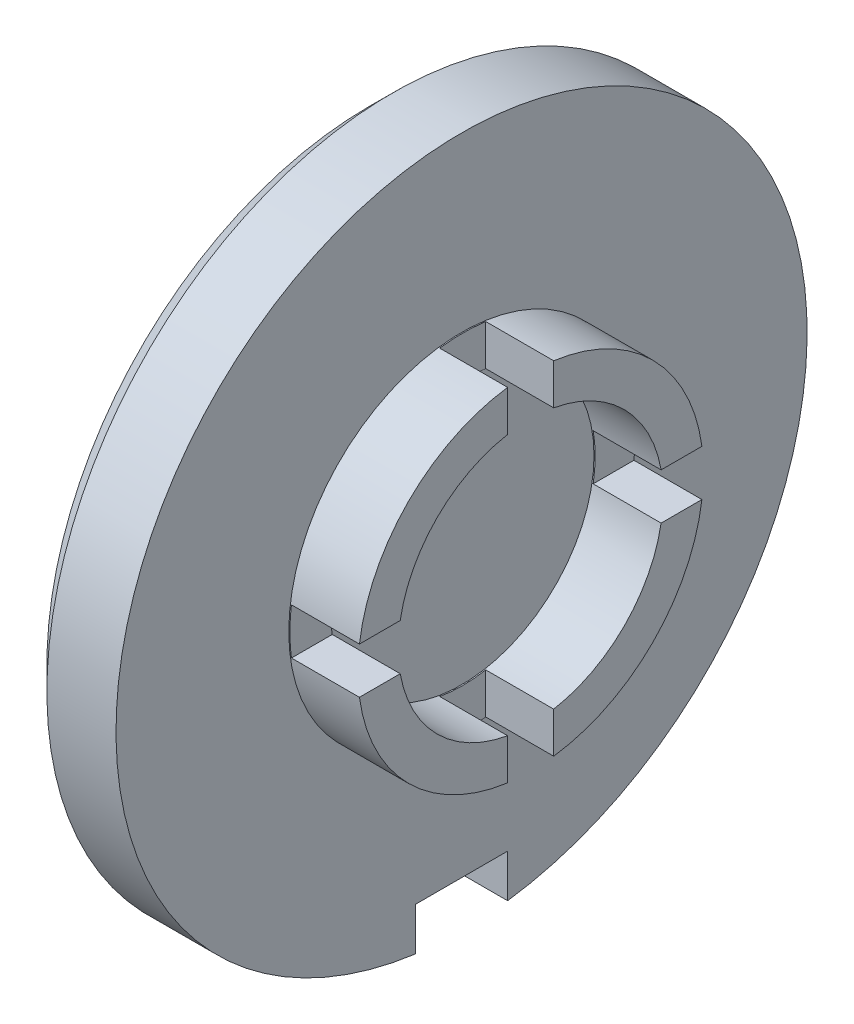
ISO-10303-21;
HEADER;
FILE_DESCRIPTION(('STEP AP214'),'2;1');
FILE_NAME('part.step','',(''),(''),'','','');
FILE_SCHEMA(('AUTOMOTIVE_DESIGN { 1 0 10303 214 1 1 1 1 }'));
ENDSEC;
DATA;
#1=APPLICATION_CONTEXT('core data for automotive mechanical design processes');
#2=APPLICATION_PROTOCOL_DEFINITION('international standard','automotive_design',2000,#1);
#3=PRODUCT_CONTEXT('',#1,'mechanical');
#4=PRODUCT('Part','Part','',(#3));
#5=PRODUCT_RELATED_PRODUCT_CATEGORY('part','',(#4));
#6=PRODUCT_DEFINITION_FORMATION('','',#4);
#7=PRODUCT_DEFINITION_CONTEXT('part definition',#1,'design');
#8=PRODUCT_DEFINITION('design','',#6,#7);
#9=PRODUCT_DEFINITION_SHAPE('','',#8);
#10=(LENGTH_UNIT() NAMED_UNIT(*) SI_UNIT(.MILLI.,.METRE.));
#11=(NAMED_UNIT(*) PLANE_ANGLE_UNIT() SI_UNIT($,.RADIAN.));
#12=(NAMED_UNIT(*) SI_UNIT($,.STERADIAN.) SOLID_ANGLE_UNIT());
#13=UNCERTAINTY_MEASURE_WITH_UNIT(LENGTH_MEASURE(1.E-05),#10,'distance_accuracy_value','');
#14=(GEOMETRIC_REPRESENTATION_CONTEXT(3) GLOBAL_UNCERTAINTY_ASSIGNED_CONTEXT((#13)) GLOBAL_UNIT_ASSIGNED_CONTEXT((#10,
#11,#12)) REPRESENTATION_CONTEXT('',''));
#15=CARTESIAN_POINT('',(0.,0.,0.));
#16=DIRECTION('',(0.,0.,1.));
#17=DIRECTION('',(1.,0.,0.));
#18=AXIS2_PLACEMENT_3D('',#15,#16,#17);
#19=CARTESIAN_POINT('',(-76.8,-20.,66.));
#20=DIRECTION('',(1.,0.,0.));
#21=DIRECTION('',(0.,0.,-1.));
#22=AXIS2_PLACEMENT_3D('',#19,#20,#21);
#23=PLANE('',#22);
#24=DIRECTION('',(0.,1.,0.));
#25=VECTOR('',#24,1.);
#26=CARTESIAN_POINT('',(-76.8,-20.,66.8));
#27=LINE('',#26,#25);
#28=CARTESIAN_POINT('',(-76.8,-25.5425625842204,66.8));
#29=VERTEX_POINT('',#28);
#30=CARTESIAN_POINT('',(-76.8,-25.2,66.8));
#31=VERTEX_POINT('',#30);
#32=EDGE_CURVE('E359',#29,#31,#27,.T.);
#33=ORIENTED_EDGE('',*,*,#32,.F.);
#34=CARTESIAN_POINT('',(-76.8,-20.,66.));
#35=DIRECTION('',(-1.,0.,0.));
#36=DIRECTION('',(0.,0.,1.));
#37=AXIS2_PLACEMENT_3D('',#34,#35,#36);
#38=CIRCLE('',#37,5.6);
#39=CARTESIAN_POINT('',(-76.8,-25.5425625842204,65.2));
#40=VERTEX_POINT('',#39);
#41=EDGE_CURVE('E260',#29,#40,#38,.T.);
#42=ORIENTED_EDGE('',*,*,#41,.T.);
#43=DIRECTION('',(0.,1.,0.));
#44=VECTOR('',#43,1.);
#45=CARTESIAN_POINT('',(-76.8,-20.,65.2));
#46=LINE('',#45,#44);
#47=CARTESIAN_POINT('',(-76.8,-25.2,65.2));
#48=VERTEX_POINT('',#47);
#49=EDGE_CURVE('E395',#40,#48,#46,.T.);
#50=ORIENTED_EDGE('',*,*,#49,.T.);
#51=DIRECTION('',(0.,0.,-1.));
#52=VECTOR('',#51,1.);
#53=CARTESIAN_POINT('',(-76.8,-25.2,66.));
#54=LINE('',#53,#52);
#55=EDGE_CURVE('E205',#31,#48,#54,.T.);
#56=ORIENTED_EDGE('',*,*,#55,.F.);
#57=EDGE_LOOP('',(#33,#42,#50,#56));
#58=FACE_BOUND('',#57,.T.);
#59=ADVANCED_FACE('F47',(#58),#23,.F.);
#60=CARTESIAN_POINT('',(-76.4,-20.,66.));
#61=DIRECTION('',(1.,0.,0.));
#62=DIRECTION('',(0.,0.,-1.));
#63=AXIS2_PLACEMENT_3D('',#60,#61,#62);
#64=CONICAL_SURFACE('',#63,6.,0.78539816339747);
#65=CARTESIAN_POINT('',(-75.5053728090001,-26.8480569582091,66.8));
#66=CARTESIAN_POINT('',(-75.6881030317566,-26.6640807466869,66.8));
#67=CARTESIAN_POINT('',(-75.8707866928955,-26.480058250433,66.8));
#68=CARTESIAN_POINT('',(-76.2360245862569,-26.1118852017641,66.8));
#69=CARTESIAN_POINT('',(-76.418578818597,-25.9277346494659,66.8));
#70=CARTESIAN_POINT('',(-76.7835219670777,-25.5592695807787,66.8));
#71=CARTESIAN_POINT('',(-76.9659108831408,-25.374955064313,66.8));
#72=CARTESIAN_POINT('',(-77.3304582431577,-25.0060979425621,66.8));
#73=CARTESIAN_POINT('',(-77.5126166868986,-24.8215553370668,66.8));
#74=CARTESIAN_POINT('',(-77.6946271909999,-24.6368667515551,66.8));
#75=B_SPLINE_CURVE_WITH_KNOTS('',3,(#65,#66,#67,#68,#69,#70,#71,#72,#73,#74),.UNSPECIFIED.,.F.,
.F.,(4,2,2,2,4),(0.,0.777906337908829,1.55581196755155,2.33371796179654,3.11162467374078),.UNSPECIFIED.);
#76=CARTESIAN_POINT('',(-76.4,-25.9464274989274,66.8));
#77=VERTEX_POINT('',#76);
#78=EDGE_CURVE('E362',#77,#29,#75,.T.);
#79=ORIENTED_EDGE('',*,*,#78,.F.);
#80=CARTESIAN_POINT('',(-76.4,-20.,66.));
#81=DIRECTION('',(-1.,0.,0.));
#82=DIRECTION('',(0.,0.,1.));
#83=AXIS2_PLACEMENT_3D('',#80,#81,#82);
#84=CIRCLE('',#83,6.);
#85=CARTESIAN_POINT('',(-76.4,-25.9464274989274,65.2));
#86=VERTEX_POINT('',#85);
#87=EDGE_CURVE('E264',#77,#86,#84,.T.);
#88=ORIENTED_EDGE('',*,*,#87,.T.);
#89=CARTESIAN_POINT('',(-75.5053728090001,-26.8480569582091,65.2));
#90=CARTESIAN_POINT('',(-75.6881030317566,-26.6640807466869,65.2));
#91=CARTESIAN_POINT('',(-75.8707866928955,-26.480058250433,65.2));
#92=CARTESIAN_POINT('',(-76.2360245862569,-26.1118852017641,65.2));
#93=CARTESIAN_POINT('',(-76.418578818597,-25.9277346494659,65.2));
#94=CARTESIAN_POINT('',(-76.7835219670777,-25.5592695807787,65.2));
#95=CARTESIAN_POINT('',(-76.9659108831408,-25.374955064313,65.2));
#96=CARTESIAN_POINT('',(-77.3304582431577,-25.0060979425621,65.2));
#97=CARTESIAN_POINT('',(-77.5126166868986,-24.8215553370668,65.2));
#98=CARTESIAN_POINT('',(-77.6946271909999,-24.6368667515551,65.2));
#99=B_SPLINE_CURVE_WITH_KNOTS('',3,(#89,#90,#91,#92,#93,#94,#95,#96,#97,#98),.UNSPECIFIED.,.F.,
.F.,(4,2,2,2,4),(0.,0.777906337908829,1.55581196755155,2.33371796179654,3.11162467374078),.UNSPECIFIED.);
#100=EDGE_CURVE('E387',#86,#40,#99,.T.);
#101=ORIENTED_EDGE('',*,*,#100,.T.);
#102=ORIENTED_EDGE('',*,*,#41,.F.);
#103=EDGE_LOOP('',(#79,#88,#101,#102));
#104=FACE_BOUND('',#103,.T.);
#105=ADVANCED_FACE('F373',(#104),#64,.T.);
#106=CARTESIAN_POINT('',(-81.8,-20.,66.));
#107=DIRECTION('',(-1.,0.,0.));
#108=DIRECTION('',(0.,0.,1.));
#109=AXIS2_PLACEMENT_3D('',#106,#107,#108);
#110=CYLINDRICAL_SURFACE('',#109,6.);
#111=DIRECTION('',(-1.,0.,0.));
#112=VECTOR('',#111,1.);
#113=CARTESIAN_POINT('',(-81.8,-25.9464274989274,66.8));
#114=LINE('',#113,#112);
#115=CARTESIAN_POINT('',(-75.2,-25.9464274989274,66.8));
#116=VERTEX_POINT('',#115);
#117=EDGE_CURVE('E371',#116,#77,#114,.T.);
#118=ORIENTED_EDGE('',*,*,#117,.F.);
#119=CARTESIAN_POINT('',(-75.2,-20.,66.));
#120=DIRECTION('',(-1.,0.,0.));
#121=DIRECTION('',(0.,0.,1.));
#122=AXIS2_PLACEMENT_3D('',#119,#120,#121);
#123=CIRCLE('',#122,6.);
#124=CARTESIAN_POINT('',(-75.2,-25.9464274989274,65.2));
#125=VERTEX_POINT('',#124);
#126=EDGE_CURVE('E268',#116,#125,#123,.T.);
#127=ORIENTED_EDGE('',*,*,#126,.T.);
#128=DIRECTION('',(-1.,0.,0.));
#129=VECTOR('',#128,1.);
#130=CARTESIAN_POINT('',(-81.8,-25.9464274989274,65.2));
#131=LINE('',#130,#129);
#132=EDGE_CURVE('E63',#125,#86,#131,.T.);
#133=ORIENTED_EDGE('',*,*,#132,.T.);
#134=ORIENTED_EDGE('',*,*,#87,.F.);
#135=EDGE_LOOP('',(#118,#127,#133,#134));
#136=FACE_BOUND('',#135,.T.);
#137=ADVANCED_FACE('F406',(#136),#110,.T.);
#138=CARTESIAN_POINT('',(-75.2,-14.,66.));
#139=DIRECTION('',(-1.,0.,0.));
#140=DIRECTION('',(0.,0.,1.));
#141=AXIS2_PLACEMENT_3D('',#138,#139,#140);
#142=PLANE('',#141);
#143=CARTESIAN_POINT('',(-75.2,-20.,66.));
#144=DIRECTION('',(-1.,0.,0.));
#145=DIRECTION('',(0.,0.,1.));
#146=AXIS2_PLACEMENT_3D('',#143,#144,#145);
#147=CIRCLE('',#146,3.);
#148=CARTESIAN_POINT('',(-75.2,-20.,69.));
#149=VERTEX_POINT('',#148);
#150=EDGE_CURVE('E271',#149,#149,#147,.T.);
#151=ORIENTED_EDGE('',*,*,#150,.T.);
#152=EDGE_LOOP('',(#151));
#153=FACE_BOUND('',#152,.T.);
#154=DIRECTION('',(0.,-1.,0.));
#155=VECTOR('',#154,1.);
#156=CARTESIAN_POINT('',(-75.2,-14.,66.8));
#157=LINE('',#156,#155);
#158=CARTESIAN_POINT('',(-75.2,-25.2,66.8));
#159=VERTEX_POINT('',#158);
#160=EDGE_CURVE('E11',#159,#116,#157,.T.);
#161=ORIENTED_EDGE('',*,*,#160,.F.);
#162=DIRECTION('',(0.,0.,1.));
#163=VECTOR('',#162,1.);
#164=CARTESIAN_POINT('',(-75.2,-25.2,66.));
#165=LINE('',#164,#163);
#166=CARTESIAN_POINT('',(-75.2,-25.2,65.2));
#167=VERTEX_POINT('',#166);
#168=EDGE_CURVE('E56',#167,#159,#165,.T.);
#169=ORIENTED_EDGE('',*,*,#168,.F.);
#170=DIRECTION('',(0.,-1.,0.));
#171=VECTOR('',#170,1.);
#172=CARTESIAN_POINT('',(-75.2,-14.,65.2));
#173=LINE('',#172,#171);
#174=EDGE_CURVE('E188',#167,#125,#173,.T.);
#175=ORIENTED_EDGE('',*,*,#174,.T.);
#176=ORIENTED_EDGE('',*,*,#126,.F.);
#177=EDGE_LOOP('',(#161,#169,#175,#176));
#178=FACE_BOUND('',#177,.T.);
#179=ADVANCED_FACE('F210',(#153,#178),#142,.F.);
#180=CARTESIAN_POINT('',(-74.,-17.,66.));
#181=DIRECTION('',(-1.,0.,0.));
#182=DIRECTION('',(0.,0.,1.));
#183=AXIS2_PLACEMENT_3D('',#180,#181,#182);
#184=PLANE('',#183);
#185=DIRECTION('',(0.,-1.,0.));
#186=VECTOR('',#185,1.);
#187=CARTESIAN_POINT('',(-74.,-17.,66.4));
#188=LINE('',#187,#186);
#189=CARTESIAN_POINT('',(-74.,-22.2649503305812,66.4));
#190=VERTEX_POINT('',#189);
#191=CARTESIAN_POINT('',(-74.,-22.9732137494637,66.4));
#192=VERTEX_POINT('',#191);
#193=EDGE_CURVE('E324',#190,#192,#188,.T.);
#194=ORIENTED_EDGE('',*,*,#193,.F.);
#195=CARTESIAN_POINT('',(-74.,-20.,66.));
#196=DIRECTION('',(-1.,0.,0.));
#197=DIRECTION('',(0.,0.,1.));
#198=AXIS2_PLACEMENT_3D('',#195,#196,#197);
#199=CIRCLE('',#198,2.3);
#200=CARTESIAN_POINT('',(-74.,-20.4,68.2649503305812));
#201=VERTEX_POINT('',#200);
#202=EDGE_CURVE('E259',#190,#201,#199,.T.);
#203=ORIENTED_EDGE('',*,*,#202,.T.);
#204=DIRECTION('',(0.,0.,-1.));
#205=VECTOR('',#204,1.);
#206=CARTESIAN_POINT('',(-74.,-20.4,66.));
#207=LINE('',#206,#205);
#208=CARTESIAN_POINT('',(-74.,-20.4,68.9732137494637));
#209=VERTEX_POINT('',#208);
#210=EDGE_CURVE('E293',#209,#201,#207,.T.);
#211=ORIENTED_EDGE('',*,*,#210,.F.);
#212=CARTESIAN_POINT('',(-74.,-20.,66.));
#213=DIRECTION('',(-1.,0.,0.));
#214=DIRECTION('',(0.,0.,1.));
#215=AXIS2_PLACEMENT_3D('',#212,#213,#214);
#216=CIRCLE('',#215,3.);
#217=EDGE_CURVE('E280',#192,#209,#216,.T.);
#218=ORIENTED_EDGE('',*,*,#217,.F.);
#219=EDGE_LOOP('',(#194,#203,#211,#218));
#220=FACE_BOUND('',#219,.T.);
#221=ADVANCED_FACE('F431',(#220),#184,.F.);
#222=DIRECTION('',(0.,-1.,0.));
#223=VECTOR('',#222,1.);
#224=CARTESIAN_POINT('',(-74.,-17.,66.4));
#225=LINE('',#224,#223);
#226=CARTESIAN_POINT('',(-74.,-17.0267862505363,66.4));
#227=VERTEX_POINT('',#226);
#228=CARTESIAN_POINT('',(-74.,-17.7350496694188,66.4));
#229=VERTEX_POINT('',#228);
#230=EDGE_CURVE('E330',#227,#229,#225,.T.);
#231=ORIENTED_EDGE('',*,*,#230,.F.);
#232=CARTESIAN_POINT('',(-74.,-19.6,68.9732137494637));
#233=VERTEX_POINT('',#232);
#234=EDGE_CURVE('E275',#233,#227,#216,.T.);
#235=ORIENTED_EDGE('',*,*,#234,.F.);
#236=DIRECTION('',(0.,0.,1.));
#237=VECTOR('',#236,1.);
#238=CARTESIAN_POINT('',(-74.,-19.6,66.));
#239=LINE('',#238,#237);
#240=CARTESIAN_POINT('',(-74.,-19.6,68.2649503305812));
#241=VERTEX_POINT('',#240);
#242=EDGE_CURVE('E300',#241,#233,#239,.T.);
#243=ORIENTED_EDGE('',*,*,#242,.F.);
#244=EDGE_CURVE('E249',#241,#229,#199,.T.);
#245=ORIENTED_EDGE('',*,*,#244,.T.);
#246=EDGE_LOOP('',(#231,#235,#243,#245));
#247=FACE_BOUND('',#246,.T.);
#248=ADVANCED_FACE('F423',(#247),#184,.F.);
#249=CARTESIAN_POINT('',(-81.8,-20.,66.));
#250=DIRECTION('',(-1.,0.,0.));
#251=DIRECTION('',(0.,0.,1.));
#252=AXIS2_PLACEMENT_3D('',#249,#250,#251);
#253=CYLINDRICAL_SURFACE('',#252,2.3);
#254=CARTESIAN_POINT('',(-75.2,-20.,66.));
#255=DIRECTION('',(-1.,0.,0.));
#256=DIRECTION('',(0.,0.,1.));
#257=AXIS2_PLACEMENT_3D('',#254,#255,#256);
#258=CIRCLE('',#257,2.3);
#259=CARTESIAN_POINT('',(-75.2,-20.,68.3));
#260=VERTEX_POINT('',#259);
#261=EDGE_CURVE('E255',#260,#260,#258,.T.);
#262=ORIENTED_EDGE('',*,*,#261,.T.);
#263=EDGE_LOOP('',(#262));
#264=FACE_BOUND('',#263,.T.);
#265=DIRECTION('',(-1.,0.,0.));
#266=VECTOR('',#265,1.);
#267=CARTESIAN_POINT('',(-81.8,-22.2649503305812,66.4));
#268=LINE('',#267,#266);
#269=CARTESIAN_POINT('',(-75.18,-22.2649503305812,66.4));
#270=VERTEX_POINT('',#269);
#271=EDGE_CURVE('E321',#270,#190,#268,.F.);
#272=ORIENTED_EDGE('',*,*,#271,.F.);
#273=CARTESIAN_POINT('',(-75.18,-20.,66.));
#274=DIRECTION('',(1.,0.,0.));
#275=DIRECTION('',(0.,0.,-1.));
#276=AXIS2_PLACEMENT_3D('',#273,#274,#275);
#277=CIRCLE('',#276,2.3);
#278=CARTESIAN_POINT('',(-75.18,-22.2649503305812,65.6));
#279=VERTEX_POINT('',#278);
#280=EDGE_CURVE('E317',#279,#270,#277,.F.);
#281=ORIENTED_EDGE('',*,*,#280,.F.);
#282=DIRECTION('',(-1.,0.,0.));
#283=VECTOR('',#282,1.);
#284=CARTESIAN_POINT('',(-81.8,-22.2649503305812,65.6));
#285=LINE('',#284,#283);
#286=CARTESIAN_POINT('',(-74.,-22.2649503305812,65.6));
#287=VERTEX_POINT('',#286);
#288=EDGE_CURVE('E333',#279,#287,#285,.F.);
#289=ORIENTED_EDGE('',*,*,#288,.T.);
#290=CARTESIAN_POINT('',(-74.,-20.4,63.7350496694188));
#291=VERTEX_POINT('',#290);
#292=EDGE_CURVE('E254',#291,#287,#199,.T.);
#293=ORIENTED_EDGE('',*,*,#292,.F.);
#294=DIRECTION('',(-1.,0.,0.));
#295=VECTOR('',#294,1.);
#296=CARTESIAN_POINT('',(-81.8,-20.4,63.7350496694188));
#297=LINE('',#296,#295);
#298=CARTESIAN_POINT('',(-75.18,-20.4,63.7350496694188));
#299=VERTEX_POINT('',#298);
#300=EDGE_CURVE('E286',#299,#291,#297,.F.);
#301=ORIENTED_EDGE('',*,*,#300,.F.);
#302=CARTESIAN_POINT('',(-75.18,-20.,66.));
#303=DIRECTION('',(1.,0.,0.));
#304=DIRECTION('',(0.,0.,-1.));
#305=AXIS2_PLACEMENT_3D('',#302,#303,#304);
#306=CIRCLE('',#305,2.3);
#307=CARTESIAN_POINT('',(-75.18,-19.6,63.7350496694188));
#308=VERTEX_POINT('',#307);
#309=EDGE_CURVE('E282',#308,#299,#306,.F.);
#310=ORIENTED_EDGE('',*,*,#309,.F.);
#311=DIRECTION('',(-1.,0.,0.));
#312=VECTOR('',#311,1.);
#313=CARTESIAN_POINT('',(-81.8,-19.6,63.7350496694188));
#314=LINE('',#313,#312);
#315=CARTESIAN_POINT('',(-74.,-19.6,63.7350496694188));
#316=VERTEX_POINT('',#315);
#317=EDGE_CURVE('E301',#316,#308,#314,.T.);
#318=ORIENTED_EDGE('',*,*,#317,.F.);
#319=CARTESIAN_POINT('',(-74.,-17.7350496694188,65.6));
#320=VERTEX_POINT('',#319);
#321=EDGE_CURVE('E253',#320,#316,#199,.T.);
#322=ORIENTED_EDGE('',*,*,#321,.F.);
#323=DIRECTION('',(-1.,0.,0.));
#324=VECTOR('',#323,1.);
#325=CARTESIAN_POINT('',(-81.8,-17.7350496694188,65.6));
#326=LINE('',#325,#324);
#327=CARTESIAN_POINT('',(-75.18,-17.7350496694188,65.6));
#328=VERTEX_POINT('',#327);
#329=EDGE_CURVE('E341',#320,#328,#326,.T.);
#330=ORIENTED_EDGE('',*,*,#329,.T.);
#331=CARTESIAN_POINT('',(-75.18,-17.7350496694188,66.4));
#332=VERTEX_POINT('',#331);
#333=EDGE_CURVE('E318',#332,#328,#277,.F.);
#334=ORIENTED_EDGE('',*,*,#333,.F.);
#335=DIRECTION('',(-1.,0.,0.));
#336=VECTOR('',#335,1.);
#337=CARTESIAN_POINT('',(-81.8,-17.7350496694188,66.4));
#338=LINE('',#337,#336);
#339=EDGE_CURVE('E327',#229,#332,#338,.T.);
#340=ORIENTED_EDGE('',*,*,#339,.F.);
#341=ORIENTED_EDGE('',*,*,#244,.F.);
#342=DIRECTION('',(-1.,0.,0.));
#343=VECTOR('',#342,1.);
#344=CARTESIAN_POINT('',(-81.8,-19.6,68.2649503305812));
#345=LINE('',#344,#343);
#346=CARTESIAN_POINT('',(-75.18,-19.6,68.2649503305812));
#347=VERTEX_POINT('',#346);
#348=EDGE_CURVE('E297',#347,#241,#345,.F.);
#349=ORIENTED_EDGE('',*,*,#348,.F.);
#350=CARTESIAN_POINT('',(-75.18,-20.4,68.2649503305812));
#351=VERTEX_POINT('',#350);
#352=EDGE_CURVE('E285',#351,#347,#306,.F.);
#353=ORIENTED_EDGE('',*,*,#352,.F.);
#354=DIRECTION('',(-1.,0.,0.));
#355=VECTOR('',#354,1.);
#356=CARTESIAN_POINT('',(-81.8,-20.4,68.2649503305812));
#357=LINE('',#356,#355);
#358=EDGE_CURVE('E290',#201,#351,#357,.T.);
#359=ORIENTED_EDGE('',*,*,#358,.F.);
#360=ORIENTED_EDGE('',*,*,#202,.F.);
#361=EDGE_LOOP('',(#272,#281,#289,#293,#301,#310,#318,#322,#330,#334,#340,#341,#349,#353,#359,#360));
#362=FACE_BOUND('',#361,.T.);
#363=ADVANCED_FACE('F420',(#264,#362),#253,.F.);
#364=CARTESIAN_POINT('',(-81.8,-20.,66.));
#365=DIRECTION('',(-1.,0.,0.));
#366=DIRECTION('',(0.,0.,1.));
#367=AXIS2_PLACEMENT_3D('',#364,#365,#366);
#368=CYLINDRICAL_SURFACE('',#367,3.);
#369=ORIENTED_EDGE('',*,*,#150,.F.);
#370=EDGE_LOOP('',(#369));
#371=FACE_BOUND('',#370,.T.);
#372=DIRECTION('',(-1.,0.,0.));
#373=VECTOR('',#372,1.);
#374=CARTESIAN_POINT('',(-81.8,-22.9732137494637,66.4));
#375=LINE('',#374,#373);
#376=CARTESIAN_POINT('',(-75.18,-22.9732137494637,66.4));
#377=VERTEX_POINT('',#376);
#378=EDGE_CURVE('E198',#192,#377,#375,.T.);
#379=ORIENTED_EDGE('',*,*,#378,.F.);
#380=ORIENTED_EDGE('',*,*,#217,.T.);
#381=DIRECTION('',(-1.,0.,0.));
#382=VECTOR('',#381,1.);
#383=CARTESIAN_POINT('',(-81.8,-20.4,68.9732137494637));
#384=LINE('',#383,#382);
#385=CARTESIAN_POINT('',(-75.18,-20.4,68.9732137494637));
#386=VERTEX_POINT('',#385);
#387=EDGE_CURVE('E230',#386,#209,#384,.F.);
#388=ORIENTED_EDGE('',*,*,#387,.F.);
#389=CARTESIAN_POINT('',(-75.18,-20.,66.));
#390=DIRECTION('',(1.,0.,0.));
#391=DIRECTION('',(0.,0.,-1.));
#392=AXIS2_PLACEMENT_3D('',#389,#390,#391);
#393=CIRCLE('',#392,3.);
#394=CARTESIAN_POINT('',(-75.18,-19.6,68.9732137494637));
#395=VERTEX_POINT('',#394);
#396=EDGE_CURVE('E234',#395,#386,#393,.T.);
#397=ORIENTED_EDGE('',*,*,#396,.F.);
#398=DIRECTION('',(-1.,0.,0.));
#399=VECTOR('',#398,1.);
#400=CARTESIAN_POINT('',(-81.8,-19.6,68.9732137494637));
#401=LINE('',#400,#399);
#402=EDGE_CURVE('E235',#233,#395,#401,.T.);
#403=ORIENTED_EDGE('',*,*,#402,.F.);
#404=ORIENTED_EDGE('',*,*,#234,.T.);
#405=DIRECTION('',(-1.,0.,0.));
#406=VECTOR('',#405,1.);
#407=CARTESIAN_POINT('',(-81.8,-17.0267862505363,66.4));
#408=LINE('',#407,#406);
#409=CARTESIAN_POINT('',(-75.18,-17.0267862505363,66.4));
#410=VERTEX_POINT('',#409);
#411=EDGE_CURVE('E220',#410,#227,#408,.F.);
#412=ORIENTED_EDGE('',*,*,#411,.F.);
#413=CARTESIAN_POINT('',(-75.18,-20.,66.));
#414=DIRECTION('',(1.,0.,0.));
#415=DIRECTION('',(0.,0.,-1.));
#416=AXIS2_PLACEMENT_3D('',#413,#414,#415);
#417=CIRCLE('',#416,3.);
#418=CARTESIAN_POINT('',(-75.18,-17.0267862505363,65.6));
#419=VERTEX_POINT('',#418);
#420=EDGE_CURVE('E223',#419,#410,#417,.T.);
#421=ORIENTED_EDGE('',*,*,#420,.F.);
#422=DIRECTION('',(-1.,0.,0.));
#423=VECTOR('',#422,1.);
#424=CARTESIAN_POINT('',(-81.8,-17.0267862505363,65.6));
#425=LINE('',#424,#423);
#426=CARTESIAN_POINT('',(-74.,-17.0267862505363,65.6));
#427=VERTEX_POINT('',#426);
#428=EDGE_CURVE('E226',#419,#427,#425,.F.);
#429=ORIENTED_EDGE('',*,*,#428,.T.);
#430=CARTESIAN_POINT('',(-74.,-19.6,63.0267862505363));
#431=VERTEX_POINT('',#430);
#432=EDGE_CURVE('E279',#427,#431,#216,.T.);
#433=ORIENTED_EDGE('',*,*,#432,.T.);
#434=DIRECTION('',(-1.,0.,0.));
#435=VECTOR('',#434,1.);
#436=CARTESIAN_POINT('',(-81.8,-19.6,63.0267862505363));
#437=LINE('',#436,#435);
#438=CARTESIAN_POINT('',(-75.18,-19.6,63.0267862505363));
#439=VERTEX_POINT('',#438);
#440=EDGE_CURVE('E245',#439,#431,#437,.F.);
#441=ORIENTED_EDGE('',*,*,#440,.F.);
#442=CARTESIAN_POINT('',(-75.18,-20.4,63.0267862505363));
#443=VERTEX_POINT('',#442);
#444=EDGE_CURVE('E241',#443,#439,#393,.T.);
#445=ORIENTED_EDGE('',*,*,#444,.F.);
#446=DIRECTION('',(-1.,0.,0.));
#447=VECTOR('',#446,1.);
#448=CARTESIAN_POINT('',(-81.8,-20.4,63.0267862505363));
#449=LINE('',#448,#447);
#450=CARTESIAN_POINT('',(-74.,-20.4,63.0267862505363));
#451=VERTEX_POINT('',#450);
#452=EDGE_CURVE('E238',#451,#443,#449,.T.);
#453=ORIENTED_EDGE('',*,*,#452,.F.);
#454=CARTESIAN_POINT('',(-74.,-22.9732137494637,65.6));
#455=VERTEX_POINT('',#454);
#456=EDGE_CURVE('E281',#451,#455,#216,.T.);
#457=ORIENTED_EDGE('',*,*,#456,.T.);
#458=DIRECTION('',(-1.,0.,0.));
#459=VECTOR('',#458,1.);
#460=CARTESIAN_POINT('',(-81.8,-22.9732137494637,65.6));
#461=LINE('',#460,#459);
#462=CARTESIAN_POINT('',(-75.18,-22.9732137494637,65.6));
#463=VERTEX_POINT('',#462);
#464=EDGE_CURVE('E216',#455,#463,#461,.T.);
#465=ORIENTED_EDGE('',*,*,#464,.T.);
#466=EDGE_CURVE('E215',#377,#463,#417,.T.);
#467=ORIENTED_EDGE('',*,*,#466,.F.);
#468=EDGE_LOOP('',(#379,#380,#388,#397,#403,#404,#412,#421,#429,#433,#441,#445,#453,#457,#465,#467));
#469=FACE_BOUND('',#468,.T.);
#470=ADVANCED_FACE('F422',(#371,#469),#368,.T.);
#471=ORIENTED_EDGE('',*,*,#292,.T.);
#472=DIRECTION('',(0.,-1.,0.));
#473=VECTOR('',#472,1.);
#474=CARTESIAN_POINT('',(-74.,-17.,65.6));
#475=LINE('',#474,#473);
#476=EDGE_CURVE('E337',#287,#455,#475,.T.);
#477=ORIENTED_EDGE('',*,*,#476,.T.);
#478=ORIENTED_EDGE('',*,*,#456,.F.);
#479=EDGE_CURVE('E289',#291,#451,#207,.T.);
#480=ORIENTED_EDGE('',*,*,#479,.F.);
#481=EDGE_LOOP('',(#471,#477,#478,#480));
#482=FACE_BOUND('',#481,.T.);
#483=ADVANCED_FACE('F49',(#482),#184,.F.);
#484=ORIENTED_EDGE('',*,*,#432,.F.);
#485=DIRECTION('',(0.,-1.,0.));
#486=VECTOR('',#485,1.);
#487=CARTESIAN_POINT('',(-74.,-17.,65.6));
#488=LINE('',#487,#486);
#489=EDGE_CURVE('E345',#427,#320,#488,.T.);
#490=ORIENTED_EDGE('',*,*,#489,.T.);
#491=ORIENTED_EDGE('',*,*,#321,.T.);
#492=EDGE_CURVE('E304',#431,#316,#239,.T.);
#493=ORIENTED_EDGE('',*,*,#492,.F.);
#494=EDGE_LOOP('',(#484,#490,#491,#493));
#495=FACE_BOUND('',#494,.T.);
#496=ADVANCED_FACE('F418',(#495),#184,.F.);
#497=CARTESIAN_POINT('',(-75.2,-17.7,66.));
#498=DIRECTION('',(-1.,0.,0.));
#499=DIRECTION('',(0.,0.,1.));
#500=AXIS2_PLACEMENT_3D('',#497,#498,#499);
#501=PLANE('',#500);
#502=ORIENTED_EDGE('',*,*,#261,.F.);
#503=EDGE_LOOP('',(#502));
#504=FACE_BOUND('',#503,.T.);
#505=ADVANCED_FACE('F415',(#504),#501,.F.);
#506=CARTESIAN_POINT('',(-75.18,-20.4,69.2));
#507=DIRECTION('',(0.,1.,0.));
#508=DIRECTION('',(0.,0.,1.));
#509=AXIS2_PLACEMENT_3D('',#506,#507,#508);
#510=PLANE('',#509);
#511=ORIENTED_EDGE('',*,*,#300,.T.);
#512=ORIENTED_EDGE('',*,*,#479,.T.);
#513=ORIENTED_EDGE('',*,*,#452,.T.);
#514=DIRECTION('',(0.,0.,-1.));
#515=VECTOR('',#514,1.);
#516=CARTESIAN_POINT('',(-75.18,-20.4,69.2));
#517=LINE('',#516,#515);
#518=EDGE_CURVE('E309',#299,#443,#517,.T.);
#519=ORIENTED_EDGE('',*,*,#518,.F.);
#520=EDGE_LOOP('',(#511,#512,#513,#519));
#521=FACE_BOUND('',#520,.T.);
#522=ADVANCED_FACE('F417',(#521),#510,.T.);
#523=CARTESIAN_POINT('',(-75.18,-19.6,69.2));
#524=DIRECTION('',(0.,-1.,0.));
#525=DIRECTION('',(0.,0.,-1.));
#526=AXIS2_PLACEMENT_3D('',#523,#524,#525);
#527=PLANE('',#526);
#528=ORIENTED_EDGE('',*,*,#317,.T.);
#529=DIRECTION('',(0.,0.,-1.));
#530=VECTOR('',#529,1.);
#531=CARTESIAN_POINT('',(-75.18,-19.6,69.2));
#532=LINE('',#531,#530);
#533=EDGE_CURVE('E314',#308,#439,#532,.T.);
#534=ORIENTED_EDGE('',*,*,#533,.T.);
#535=ORIENTED_EDGE('',*,*,#440,.T.);
#536=ORIENTED_EDGE('',*,*,#492,.T.);
#537=EDGE_LOOP('',(#528,#534,#535,#536));
#538=FACE_BOUND('',#537,.T.);
#539=ADVANCED_FACE('F461',(#538),#527,.T.);
#540=CARTESIAN_POINT('',(-75.18,-20.4,69.2));
#541=DIRECTION('',(1.,0.,0.));
#542=DIRECTION('',(0.,0.,-1.));
#543=AXIS2_PLACEMENT_3D('',#540,#541,#542);
#544=PLANE('',#543);
#545=ORIENTED_EDGE('',*,*,#309,.T.);
#546=ORIENTED_EDGE('',*,*,#518,.T.);
#547=ORIENTED_EDGE('',*,*,#444,.T.);
#548=ORIENTED_EDGE('',*,*,#533,.F.);
#549=EDGE_LOOP('',(#545,#546,#547,#548));
#550=FACE_BOUND('',#549,.T.);
#551=ADVANCED_FACE('F484',(#550),#544,.T.);
#552=ORIENTED_EDGE('',*,*,#352,.T.);
#553=EDGE_CURVE('E313',#395,#347,#532,.T.);
#554=ORIENTED_EDGE('',*,*,#553,.F.);
#555=ORIENTED_EDGE('',*,*,#396,.T.);
#556=EDGE_CURVE('E308',#386,#351,#517,.T.);
#557=ORIENTED_EDGE('',*,*,#556,.T.);
#558=EDGE_LOOP('',(#552,#554,#555,#557));
#559=FACE_BOUND('',#558,.T.);
#560=ADVANCED_FACE('F486',(#559),#544,.T.);
#561=ORIENTED_EDGE('',*,*,#358,.T.);
#562=ORIENTED_EDGE('',*,*,#556,.F.);
#563=ORIENTED_EDGE('',*,*,#387,.T.);
#564=ORIENTED_EDGE('',*,*,#210,.T.);
#565=EDGE_LOOP('',(#561,#562,#563,#564));
#566=FACE_BOUND('',#565,.T.);
#567=ADVANCED_FACE('F491',(#566),#510,.T.);
#568=ORIENTED_EDGE('',*,*,#348,.T.);
#569=ORIENTED_EDGE('',*,*,#242,.T.);
#570=ORIENTED_EDGE('',*,*,#402,.T.);
#571=ORIENTED_EDGE('',*,*,#553,.T.);
#572=EDGE_LOOP('',(#568,#569,#570,#571));
#573=FACE_BOUND('',#572,.T.);
#574=ADVANCED_FACE('F495',(#573),#527,.T.);
#575=CARTESIAN_POINT('',(0.,0.,65.6));
#576=DIRECTION('',(0.,0.,-1.));
#577=DIRECTION('',(-1.,0.,0.));
#578=AXIS2_PLACEMENT_3D('',#575,#576,#577);
#579=PLANE('',#578);
#580=ORIENTED_EDGE('',*,*,#489,.F.);
#581=ORIENTED_EDGE('',*,*,#428,.F.);
#582=DIRECTION('',(0.,-1.,0.));
#583=VECTOR('',#582,1.);
#584=CARTESIAN_POINT('',(-75.18,-23.2,65.6));
#585=LINE('',#584,#583);
#586=EDGE_CURVE('E352',#419,#328,#585,.T.);
#587=ORIENTED_EDGE('',*,*,#586,.T.);
#588=ORIENTED_EDGE('',*,*,#329,.F.);
#589=EDGE_LOOP('',(#580,#581,#587,#588));
#590=FACE_BOUND('',#589,.T.);
#591=ADVANCED_FACE('F573',(#590),#579,.F.);
#592=CARTESIAN_POINT('',(0.,0.,66.4));
#593=DIRECTION('',(0.,0.,-1.));
#594=DIRECTION('',(-1.,0.,0.));
#595=AXIS2_PLACEMENT_3D('',#592,#593,#594);
#596=PLANE('',#595);
#597=ORIENTED_EDGE('',*,*,#339,.T.);
#598=DIRECTION('',(0.,-1.,0.));
#599=VECTOR('',#598,1.);
#600=CARTESIAN_POINT('',(-75.18,-23.2,66.4));
#601=LINE('',#600,#599);
#602=EDGE_CURVE('E349',#410,#332,#601,.T.);
#603=ORIENTED_EDGE('',*,*,#602,.F.);
#604=ORIENTED_EDGE('',*,*,#411,.T.);
#605=ORIENTED_EDGE('',*,*,#230,.T.);
#606=EDGE_LOOP('',(#597,#603,#604,#605));
#607=FACE_BOUND('',#606,.T.);
#608=ADVANCED_FACE('F591',(#607),#596,.T.);
#609=CARTESIAN_POINT('',(-75.18,-23.2,66.4));
#610=DIRECTION('',(1.,0.,0.));
#611=DIRECTION('',(0.,0.,-1.));
#612=AXIS2_PLACEMENT_3D('',#609,#610,#611);
#613=PLANE('',#612);
#614=ORIENTED_EDGE('',*,*,#333,.T.);
#615=ORIENTED_EDGE('',*,*,#586,.F.);
#616=ORIENTED_EDGE('',*,*,#420,.T.);
#617=ORIENTED_EDGE('',*,*,#602,.T.);
#618=EDGE_LOOP('',(#614,#615,#616,#617));
#619=FACE_BOUND('',#618,.T.);
#620=ADVANCED_FACE('F600',(#619),#613,.T.);
#621=ORIENTED_EDGE('',*,*,#280,.T.);
#622=EDGE_CURVE('E353',#270,#377,#601,.T.);
#623=ORIENTED_EDGE('',*,*,#622,.T.);
#624=ORIENTED_EDGE('',*,*,#466,.T.);
#625=EDGE_CURVE('E71',#279,#463,#585,.T.);
#626=ORIENTED_EDGE('',*,*,#625,.F.);
#627=EDGE_LOOP('',(#621,#623,#624,#626));
#628=FACE_BOUND('',#627,.T.);
#629=ADVANCED_FACE('F477',(#628),#613,.T.);
#630=ORIENTED_EDGE('',*,*,#271,.T.);
#631=ORIENTED_EDGE('',*,*,#193,.T.);
#632=ORIENTED_EDGE('',*,*,#378,.T.);
#633=ORIENTED_EDGE('',*,*,#622,.F.);
#634=EDGE_LOOP('',(#630,#631,#632,#633));
#635=FACE_BOUND('',#634,.T.);
#636=ADVANCED_FACE('F442',(#635),#596,.T.);
#637=ORIENTED_EDGE('',*,*,#625,.T.);
#638=ORIENTED_EDGE('',*,*,#464,.F.);
#639=ORIENTED_EDGE('',*,*,#476,.F.);
#640=ORIENTED_EDGE('',*,*,#288,.F.);
#641=EDGE_LOOP('',(#637,#638,#639,#640));
#642=FACE_BOUND('',#641,.T.);
#643=ADVANCED_FACE('F475',(#642),#579,.F.);
#644=CARTESIAN_POINT('',(-76.9,-25.2,66.8));
#645=DIRECTION('',(0.,-1.,0.));
#646=DIRECTION('',(0.,0.,-1.));
#647=AXIS2_PLACEMENT_3D('',#644,#645,#646);
#648=PLANE('',#647);
#649=ORIENTED_EDGE('',*,*,#55,.T.);
#650=DIRECTION('',(-1.,0.,0.));
#651=VECTOR('',#650,1.);
#652=CARTESIAN_POINT('',(-76.9,-25.2,65.2));
#653=LINE('',#652,#651);
#654=EDGE_CURVE('E191',#167,#48,#653,.T.);
#655=ORIENTED_EDGE('',*,*,#654,.F.);
#656=ORIENTED_EDGE('',*,*,#168,.T.);
#657=DIRECTION('',(-1.,0.,0.));
#658=VECTOR('',#657,1.);
#659=CARTESIAN_POINT('',(-76.9,-25.2,66.8));
#660=LINE('',#659,#658);
#661=EDGE_CURVE('E207',#159,#31,#660,.T.);
#662=ORIENTED_EDGE('',*,*,#661,.T.);
#663=EDGE_LOOP('',(#649,#655,#656,#662));
#664=FACE_BOUND('',#663,.T.);
#665=ADVANCED_FACE('F201',(#664),#648,.T.);
#666=CARTESIAN_POINT('',(0.,0.,66.8));
#667=DIRECTION('',(0.,0.,-1.));
#668=DIRECTION('',(-1.,0.,0.));
#669=AXIS2_PLACEMENT_3D('',#666,#667,#668);
#670=PLANE('',#669);
#671=ORIENTED_EDGE('',*,*,#32,.T.);
#672=ORIENTED_EDGE('',*,*,#661,.F.);
#673=ORIENTED_EDGE('',*,*,#160,.T.);
#674=ORIENTED_EDGE('',*,*,#117,.T.);
#675=ORIENTED_EDGE('',*,*,#78,.T.);
#676=EDGE_LOOP('',(#671,#672,#673,#674,#675));
#677=FACE_BOUND('',#676,.T.);
#678=ADVANCED_FACE('F377',(#677),#670,.T.);
#679=CARTESIAN_POINT('',(0.,0.,65.2));
#680=DIRECTION('',(0.,0.,-1.));
#681=DIRECTION('',(-1.,0.,0.));
#682=AXIS2_PLACEMENT_3D('',#679,#680,#681);
#683=PLANE('',#682);
#684=ORIENTED_EDGE('',*,*,#100,.F.);
#685=ORIENTED_EDGE('',*,*,#132,.F.);
#686=ORIENTED_EDGE('',*,*,#174,.F.);
#687=ORIENTED_EDGE('',*,*,#654,.T.);
#688=ORIENTED_EDGE('',*,*,#49,.F.);
#689=EDGE_LOOP('',(#684,#685,#686,#687,#688));
#690=FACE_BOUND('',#689,.T.);
#691=ADVANCED_FACE('F190',(#690),#683,.F.);
#692=CLOSED_SHELL('',(#59,#105,#137,#179,#221,#248,#363,#470,#483,#496,#505,#522,#539,#551,#560,
#567,#574,#591,#608,#620,#629,#636,#643,#665,#678,#691));
#693=MANIFOLD_SOLID_BREP('B2',#692);
#694=ADVANCED_BREP_SHAPE_REPRESENTATION('',(#18,#693),#14);
#695=SHAPE_DEFINITION_REPRESENTATION(#9,#694);
ENDSEC;
END-ISO-10303-21;
